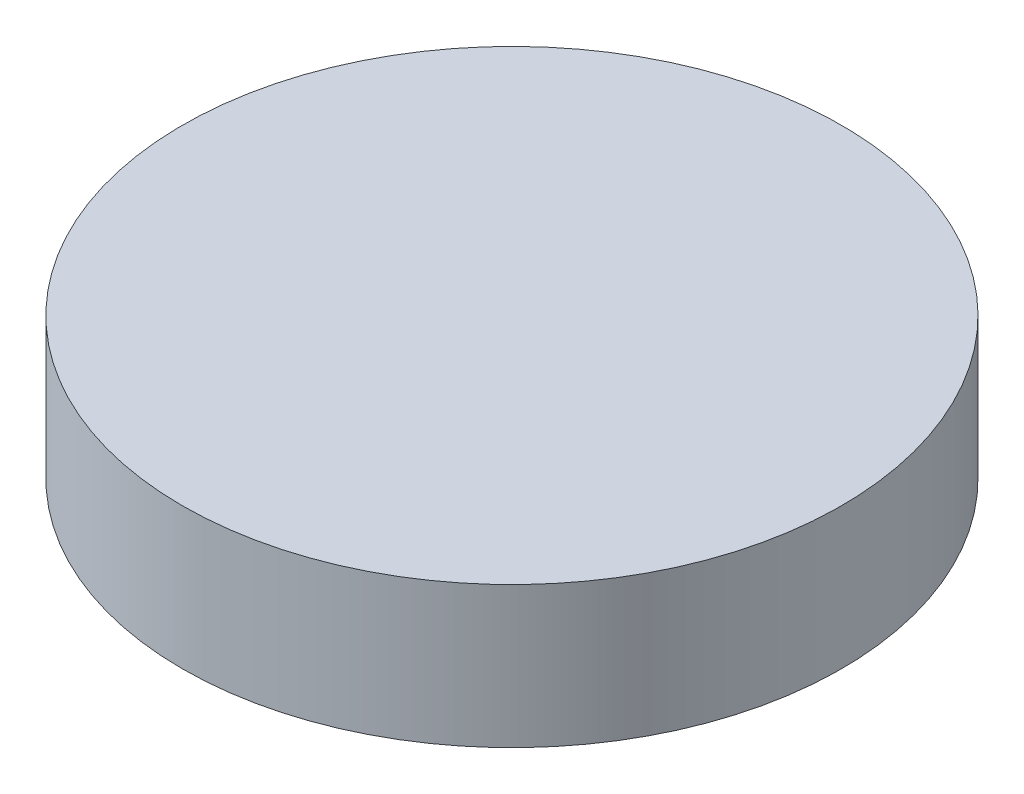
ISO-10303-21;
HEADER;
FILE_DESCRIPTION(('STEP AP214'),'2;1');
FILE_NAME('part.step','',(''),(''),'','','');
FILE_SCHEMA(('AUTOMOTIVE_DESIGN { 1 0 10303 214 1 1 1 1 }'));
ENDSEC;
DATA;
#1=APPLICATION_CONTEXT('core data for automotive mechanical design processes');
#2=APPLICATION_PROTOCOL_DEFINITION('international standard','automotive_design',2000,#1);
#3=PRODUCT_CONTEXT('',#1,'mechanical');
#4=PRODUCT('Part','Part','',(#3));
#5=PRODUCT_RELATED_PRODUCT_CATEGORY('part','',(#4));
#6=PRODUCT_DEFINITION_FORMATION('','',#4);
#7=PRODUCT_DEFINITION_CONTEXT('part definition',#1,'design');
#8=PRODUCT_DEFINITION('design','',#6,#7);
#9=PRODUCT_DEFINITION_SHAPE('','',#8);
#10=(LENGTH_UNIT() NAMED_UNIT(*) SI_UNIT(.MILLI.,.METRE.));
#11=(NAMED_UNIT(*) PLANE_ANGLE_UNIT() SI_UNIT($,.RADIAN.));
#12=(NAMED_UNIT(*) SI_UNIT($,.STERADIAN.) SOLID_ANGLE_UNIT());
#13=UNCERTAINTY_MEASURE_WITH_UNIT(LENGTH_MEASURE(1.E-05),#10,'distance_accuracy_value','');
#14=(GEOMETRIC_REPRESENTATION_CONTEXT(3) GLOBAL_UNCERTAINTY_ASSIGNED_CONTEXT((#13)) GLOBAL_UNIT_ASSIGNED_CONTEXT((#10,
#11,#12)) REPRESENTATION_CONTEXT('',''));
#15=CARTESIAN_POINT('',(0.,0.,0.));
#16=DIRECTION('',(0.,0.,1.));
#17=DIRECTION('',(1.,0.,0.));
#18=AXIS2_PLACEMENT_3D('',#15,#16,#17);
#19=CARTESIAN_POINT('',(0.,6.,0.));
#20=DIRECTION('',(0.,-1.,0.));
#21=DIRECTION('',(0.,0.,-1.));
#22=AXIS2_PLACEMENT_3D('',#19,#20,#21);
#23=CYLINDRICAL_SURFACE('',#22,14.);
#24=CARTESIAN_POINT('',(0.,6.,0.));
#25=DIRECTION('',(0.,1.,0.));
#26=DIRECTION('',(0.,0.,1.));
#27=AXIS2_PLACEMENT_3D('',#24,#25,#26);
#28=CIRCLE('',#27,14.);
#29=CARTESIAN_POINT('',(0.,6.,14.));
#30=VERTEX_POINT('',#29);
#31=EDGE_CURVE('E10',#30,#30,#28,.T.);
#32=ORIENTED_EDGE('',*,*,#31,.F.);
#33=EDGE_LOOP('',(#32));
#34=FACE_BOUND('',#33,.T.);
#35=CARTESIAN_POINT('',(0.,0.,0.));
#36=DIRECTION('',(0.,1.,0.));
#37=DIRECTION('',(0.,0.,1.));
#38=AXIS2_PLACEMENT_3D('',#35,#36,#37);
#39=CIRCLE('',#38,14.);
#40=CARTESIAN_POINT('',(0.,0.,14.));
#41=VERTEX_POINT('',#40);
#42=EDGE_CURVE('E46',#41,#41,#39,.T.);
#43=ORIENTED_EDGE('',*,*,#42,.T.);
#44=EDGE_LOOP('',(#43));
#45=FACE_BOUND('',#44,.T.);
#46=ADVANCED_FACE('F43',(#34,#45),#23,.T.);
#47=CARTESIAN_POINT('',(0.,6.,0.));
#48=DIRECTION('',(0.,1.,0.));
#49=DIRECTION('',(0.,0.,1.));
#50=AXIS2_PLACEMENT_3D('',#47,#48,#49);
#51=PLANE('',#50);
#52=ORIENTED_EDGE('',*,*,#31,.T.);
#53=EDGE_LOOP('',(#52));
#54=FACE_BOUND('',#53,.T.);
#55=ADVANCED_FACE('F80',(#54),#51,.T.);
#56=CARTESIAN_POINT('',(0.,0.,0.));
#57=DIRECTION('',(0.,1.,0.));
#58=DIRECTION('',(0.,0.,1.));
#59=AXIS2_PLACEMENT_3D('',#56,#57,#58);
#60=PLANE('',#59);
#61=CARTESIAN_POINT('',(0.,0.,0.));
#62=DIRECTION('',(0.,1.,0.));
#63=DIRECTION('',(0.,0.,1.));
#64=AXIS2_PLACEMENT_3D('',#61,#62,#63);
#65=CIRCLE('',#64,2.5);
#66=CARTESIAN_POINT('',(0.,0.,2.5));
#67=VERTEX_POINT('',#66);
#68=EDGE_CURVE('E58',#67,#67,#65,.T.);
#69=ORIENTED_EDGE('',*,*,#68,.T.);
#70=EDGE_LOOP('',(#69));
#71=FACE_BOUND('',#70,.T.);
#72=ORIENTED_EDGE('',*,*,#42,.F.);
#73=EDGE_LOOP('',(#72));
#74=FACE_BOUND('',#73,.T.);
#75=ADVANCED_FACE('F64',(#71,#74),#60,.F.);
#76=CARTESIAN_POINT('',(0.,0.,0.));
#77=DIRECTION('',(0.,-1.,0.));
#78=DIRECTION('',(0.,0.,1.));
#79=AXIS2_PLACEMENT_3D('',#76,#77,#78);
#80=CONICAL_SURFACE('',#79,2.5,0.78539816339745);
#81=CARTESIAN_POINT('',(0.,2.4,0.));
#82=DIRECTION('',(0.,1.,0.));
#83=DIRECTION('',(0.,0.,1.));
#84=AXIS2_PLACEMENT_3D('',#81,#82,#83);
#85=CIRCLE('',#84,0.099999999999992);
#86=CARTESIAN_POINT('',(0.,2.4,0.099999999999992));
#87=VERTEX_POINT('',#86);
#88=EDGE_CURVE('E54',#87,#87,#85,.T.);
#89=CARTESIAN_POINT('',(0.,2.4,0.099999999999992));
#90=CARTESIAN_POINT('',(0.,2.375,0.124999999999992));
#91=CARTESIAN_POINT('',(0.,2.35,0.149999999999992));
#92=CARTESIAN_POINT('',(0.,2.3,0.199999999999993));
#93=CARTESIAN_POINT('',(0.,2.275,0.224999999999993));
#94=CARTESIAN_POINT('',(0.,2.225,0.274999999999993));
#95=CARTESIAN_POINT('',(0.,2.2,0.299999999999993));
#96=CARTESIAN_POINT('',(0.,2.15,0.349999999999993));
#97=CARTESIAN_POINT('',(0.,2.125,0.374999999999993));
#98=CARTESIAN_POINT('',(0.,2.075,0.424999999999993));
#99=CARTESIAN_POINT('',(0.,2.05,0.449999999999993));
#100=CARTESIAN_POINT('',(0.,2.,0.499999999999993));
#101=CARTESIAN_POINT('',(0.,1.975,0.524999999999993));
#102=CARTESIAN_POINT('',(0.,1.925,0.574999999999994));
#103=CARTESIAN_POINT('',(0.,1.9,0.599999999999994));
#104=CARTESIAN_POINT('',(0.,1.85,0.649999999999994));
#105=CARTESIAN_POINT('',(0.,1.825,0.674999999999994));
#106=CARTESIAN_POINT('',(0.,1.775,0.724999999999994));
#107=CARTESIAN_POINT('',(0.,1.75,0.749999999999994));
#108=CARTESIAN_POINT('',(0.,1.7,0.799999999999994));
#109=CARTESIAN_POINT('',(0.,1.675,0.824999999999995));
#110=CARTESIAN_POINT('',(0.,1.625,0.874999999999995));
#111=CARTESIAN_POINT('',(0.,1.6,0.899999999999995));
#112=CARTESIAN_POINT('',(0.,1.55,0.949999999999995));
#113=CARTESIAN_POINT('',(0.,1.525,0.974999999999995));
#114=CARTESIAN_POINT('',(0.,1.475,1.025));
#115=CARTESIAN_POINT('',(0.,1.45,1.05));
#116=CARTESIAN_POINT('',(0.,1.4,1.1));
#117=CARTESIAN_POINT('',(0.,1.375,1.125));
#118=CARTESIAN_POINT('',(0.,1.325,1.175));
#119=CARTESIAN_POINT('',(0.,1.3,1.2));
#120=CARTESIAN_POINT('',(0.,1.25,1.25));
#121=CARTESIAN_POINT('',(0.,1.225,1.275));
#122=CARTESIAN_POINT('',(0.,1.175,1.325));
#123=CARTESIAN_POINT('',(0.,1.15,1.35));
#124=CARTESIAN_POINT('',(0.,1.1,1.4));
#125=CARTESIAN_POINT('',(0.,1.075,1.425));
#126=CARTESIAN_POINT('',(0.,1.025,1.475));
#127=CARTESIAN_POINT('',(0.,1.,1.5));
#128=CARTESIAN_POINT('',(0.,0.95,1.55));
#129=CARTESIAN_POINT('',(0.,0.925,1.575));
#130=CARTESIAN_POINT('',(0.,0.875,1.625));
#131=CARTESIAN_POINT('',(0.,0.85,1.65));
#132=CARTESIAN_POINT('',(0.,0.8,1.7));
#133=CARTESIAN_POINT('',(0.,0.775,1.725));
#134=CARTESIAN_POINT('',(0.,0.725,1.775));
#135=CARTESIAN_POINT('',(0.,0.7,1.8));
#136=CARTESIAN_POINT('',(0.,0.65,1.85));
#137=CARTESIAN_POINT('',(0.,0.625,1.875));
#138=CARTESIAN_POINT('',(0.,0.575,1.925));
#139=CARTESIAN_POINT('',(0.,0.55,1.95));
#140=CARTESIAN_POINT('',(0.,0.5,2.));
#141=CARTESIAN_POINT('',(0.,0.475,2.025));
#142=CARTESIAN_POINT('',(0.,0.425,2.075));
#143=CARTESIAN_POINT('',(0.,0.4,2.1));
#144=CARTESIAN_POINT('',(0.,0.35,2.15));
#145=CARTESIAN_POINT('',(0.,0.325,2.175));
#146=CARTESIAN_POINT('',(0.,0.275,2.225));
#147=CARTESIAN_POINT('',(0.,0.25,2.25));
#148=CARTESIAN_POINT('',(0.,0.2,2.3));
#149=CARTESIAN_POINT('',(0.,0.175,2.325));
#150=CARTESIAN_POINT('',(0.,0.125,2.375));
#151=CARTESIAN_POINT('',(0.,0.1,2.4));
#152=CARTESIAN_POINT('',(0.,0.0499999999999999,2.45));
#153=CARTESIAN_POINT('',(0.,0.0249999999999999,2.475));
#154=CARTESIAN_POINT('',(0.,0.,2.5));
#155=B_SPLINE_CURVE_WITH_KNOTS('',3,(#89,#90,#91,#92,#93,#94,#95,#96,#97,#98,#99,#100,#101,#102,
#103,#104,#105,#106,#107,#108,#109,#110,#111,#112,#113,#114,#115,#116,#117,#118,#119,#120,#121,
#122,#123,#124,#125,#126,#127,#128,#129,#130,#131,#132,#133,#134,#135,#136,#137,#138,#139,#140,
#141,#142,#143,#144,#145,#146,#147,#148,#149,#150,#151,#152,#153,#154),.UNSPECIFIED.,.F.,.F.,(4,
2,2,2,2,2,2,2,2,2,2,2,2,2,2,2,2,2,2,2,2,2,2,2,2,2,2,2,2,2,2,2,4),(0.,0.106066017177982,
0.212132034355965,0.318198051533947,0.424264068711929,0.530330085889911,0.636396103067894,
0.742462120245876,0.848528137423858,0.954594154601841,1.06066017177982,1.16672618895781,
1.27279220613579,1.37885822331377,1.48492424049175,1.59099025766973,1.69705627484772,
1.8031222920257,1.90918830920368,2.01525432638166,2.12132034355965,2.22738636073763,
2.33345237791561,2.43951839509359,2.54558441227157,2.65165042944956,2.75771644662754,
2.86378246380552,2.9698484809835,3.07591449816149,3.18198051533947,3.28804653251745,
3.39411254969543),.UNSPECIFIED.);
#156=EDGE_CURVE('BSEAM66',#87,#67,#155,.T.);
#157=ORIENTED_EDGE('',*,*,#88,.T.);
#158=ORIENTED_EDGE('',*,*,#68,.F.);
#159=ORIENTED_EDGE('',*,*,#156,.T.);
#160=ORIENTED_EDGE('',*,*,#156,.F.);
#161=EDGE_LOOP('',(#157,#159,#158,#160));
#162=FACE_BOUND('',#161,.T.);
#163=ADVANCED_FACE('F66',(#162),#80,.F.);
#164=CARTESIAN_POINT('',(0.,2.4,0.));
#165=DIRECTION('',(0.,1.,0.));
#166=DIRECTION('',(0.,0.,1.));
#167=AXIS2_PLACEMENT_3D('',#164,#165,#166);
#168=PLANE('',#167);
#169=ORIENTED_EDGE('',*,*,#88,.F.);
#170=EDGE_LOOP('',(#169));
#171=FACE_BOUND('',#170,.T.);
#172=ADVANCED_FACE('F68',(#171),#168,.F.);
#173=CLOSED_SHELL('',(#46,#55,#75,#163,#172));
#174=MANIFOLD_SOLID_BREP('B2',#173);
#175=ADVANCED_BREP_SHAPE_REPRESENTATION('',(#18,#174),#14);
#176=SHAPE_DEFINITION_REPRESENTATION(#9,#175);
ENDSEC;
END-ISO-10303-21;
